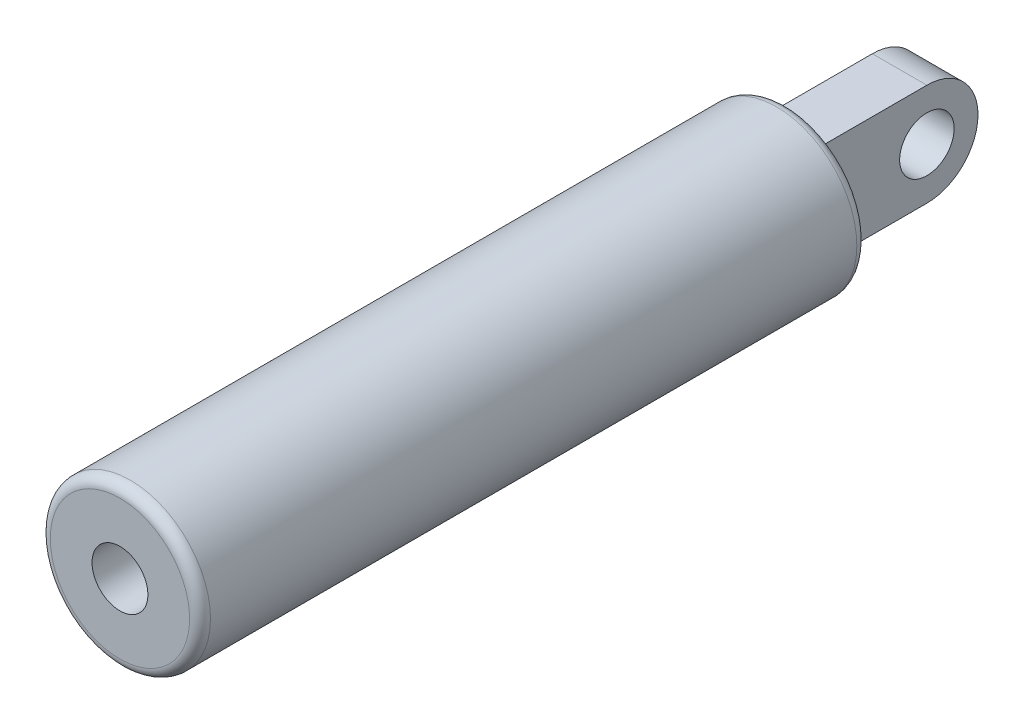
ISO-10303-21;
HEADER;
FILE_DESCRIPTION(('STEP AP214'),'2;1');
FILE_NAME('part.step','',(''),(''),'','','');
FILE_SCHEMA(('AUTOMOTIVE_DESIGN { 1 0 10303 214 1 1 1 1 }'));
ENDSEC;
DATA;
#1=APPLICATION_CONTEXT('core data for automotive mechanical design processes');
#2=APPLICATION_PROTOCOL_DEFINITION('international standard','automotive_design',2000,#1);
#3=PRODUCT_CONTEXT('',#1,'mechanical');
#4=PRODUCT('Part','Part','',(#3));
#5=PRODUCT_RELATED_PRODUCT_CATEGORY('part','',(#4));
#6=PRODUCT_DEFINITION_FORMATION('','',#4);
#7=PRODUCT_DEFINITION_CONTEXT('part definition',#1,'design');
#8=PRODUCT_DEFINITION('design','',#6,#7);
#9=PRODUCT_DEFINITION_SHAPE('','',#8);
#10=(LENGTH_UNIT() NAMED_UNIT(*) SI_UNIT(.MILLI.,.METRE.));
#11=(NAMED_UNIT(*) PLANE_ANGLE_UNIT() SI_UNIT($,.RADIAN.));
#12=(NAMED_UNIT(*) SI_UNIT($,.STERADIAN.) SOLID_ANGLE_UNIT());
#13=UNCERTAINTY_MEASURE_WITH_UNIT(LENGTH_MEASURE(1.E-05),#10,'distance_accuracy_value','');
#14=(GEOMETRIC_REPRESENTATION_CONTEXT(3) GLOBAL_UNCERTAINTY_ASSIGNED_CONTEXT((#13)) GLOBAL_UNIT_ASSIGNED_CONTEXT((#10,
#11,#12)) REPRESENTATION_CONTEXT('',''));
#15=CARTESIAN_POINT('',(0.,0.,0.));
#16=DIRECTION('',(0.,0.,1.));
#17=DIRECTION('',(1.,0.,0.));
#18=AXIS2_PLACEMENT_3D('',#15,#16,#17);
#19=CARTESIAN_POINT('',(0.,0.,-36.703));
#20=DIRECTION('',(0.,0.,1.));
#21=DIRECTION('',(1.,0.,0.));
#22=AXIS2_PLACEMENT_3D('',#19,#20,#21);
#23=PLANE('',#22);
#24=CARTESIAN_POINT('',(0.,0.,-36.703));
#25=DIRECTION('',(0.,0.,1.));
#26=DIRECTION('',(1.,0.,0.));
#27=AXIS2_PLACEMENT_3D('',#24,#25,#26);
#28=CIRCLE('',#27,5.19176);
#29=CARTESIAN_POINT('',(5.19176,0.,-36.703));
#30=VERTEX_POINT('',#29);
#31=EDGE_CURVE('E41',#30,#30,#28,.F.);
#32=ORIENTED_EDGE('',*,*,#31,.T.);
#33=EDGE_LOOP('',(#32));
#34=FACE_BOUND('',#33,.T.);
#35=DIRECTION('',(-1.,0.,0.));
#36=VECTOR('',#35,1.);
#37=CARTESIAN_POINT('',(2.032,-3.81,-36.703));
#38=LINE('',#37,#36);
#39=CARTESIAN_POINT('',(2.032,-3.81,-36.703));
#40=VERTEX_POINT('',#39);
#41=CARTESIAN_POINT('',(-2.032,-3.81,-36.703));
#42=VERTEX_POINT('',#41);
#43=EDGE_CURVE('E48',#40,#42,#38,.T.);
#44=ORIENTED_EDGE('',*,*,#43,.F.);
#45=DIRECTION('',(0.,-1.,0.));
#46=VECTOR('',#45,1.);
#47=CARTESIAN_POINT('',(2.032,-3.81,-36.703));
#48=LINE('',#47,#46);
#49=CARTESIAN_POINT('',(2.032,3.81,-36.703));
#50=VERTEX_POINT('',#49);
#51=EDGE_CURVE('E80',#50,#40,#48,.T.);
#52=ORIENTED_EDGE('',*,*,#51,.F.);
#53=DIRECTION('',(-1.,0.,0.));
#54=VECTOR('',#53,1.);
#55=CARTESIAN_POINT('',(2.032,3.81,-36.703));
#56=LINE('',#55,#54);
#57=CARTESIAN_POINT('',(-2.032,3.81,-36.703));
#58=VERTEX_POINT('',#57);
#59=EDGE_CURVE('E96',#50,#58,#56,.T.);
#60=ORIENTED_EDGE('',*,*,#59,.T.);
#61=DIRECTION('',(0.,-1.,0.));
#62=VECTOR('',#61,1.);
#63=CARTESIAN_POINT('',(-2.032,-3.81,-36.703));
#64=LINE('',#63,#62);
#65=EDGE_CURVE('E53',#58,#42,#64,.T.);
#66=ORIENTED_EDGE('',*,*,#65,.T.);
#67=EDGE_LOOP('',(#44,#52,#60,#66));
#68=FACE_BOUND('',#67,.T.);
#69=ADVANCED_FACE('F33',(#34,#68),#23,.F.);
#70=CARTESIAN_POINT('',(0.,0.,45.085));
#71=DIRECTION('',(0.,0.,1.));
#72=DIRECTION('',(1.,0.,0.));
#73=AXIS2_PLACEMENT_3D('',#70,#71,#72);
#74=CYLINDRICAL_SURFACE('',#73,5.969);
#75=CARTESIAN_POINT('',(0.,0.,-35.92576));
#76=DIRECTION('',(0.,0.,1.));
#77=DIRECTION('',(1.,0.,0.));
#78=AXIS2_PLACEMENT_3D('',#75,#76,#77);
#79=CIRCLE('',#78,5.969);
#80=CARTESIAN_POINT('',(5.969,0.,-35.92576));
#81=VERTEX_POINT('',#80);
#82=EDGE_CURVE('E120',#81,#81,#79,.T.);
#83=ORIENTED_EDGE('',*,*,#82,.T.);
#84=EDGE_LOOP('',(#83));
#85=FACE_BOUND('',#84,.T.);
#86=CARTESIAN_POINT('',(0.,0.,12.25296));
#87=DIRECTION('',(0.,0.,-1.));
#88=DIRECTION('',(-1.,0.,0.));
#89=AXIS2_PLACEMENT_3D('',#86,#87,#88);
#90=CIRCLE('',#89,5.969);
#91=CARTESIAN_POINT('',(-5.969,0.,12.25296));
#92=VERTEX_POINT('',#91);
#93=EDGE_CURVE('E117',#92,#92,#90,.T.);
#94=ORIENTED_EDGE('',*,*,#93,.T.);
#95=EDGE_LOOP('',(#94));
#96=FACE_BOUND('',#95,.T.);
#97=ADVANCED_FACE('F132',(#85,#96),#74,.T.);
#98=CARTESIAN_POINT('',(0.,2.0828,13.0302));
#99=DIRECTION('',(0.,0.,-1.));
#100=DIRECTION('',(-1.,0.,0.));
#101=AXIS2_PLACEMENT_3D('',#98,#99,#100);
#102=PLANE('',#101);
#103=CARTESIAN_POINT('',(0.,0.,13.0302));
#104=DIRECTION('',(0.,0.,-1.));
#105=DIRECTION('',(-1.,0.,0.));
#106=AXIS2_PLACEMENT_3D('',#103,#104,#105);
#107=CIRCLE('',#106,5.19176);
#108=CARTESIAN_POINT('',(-5.19176,0.,13.0302));
#109=VERTEX_POINT('',#108);
#110=EDGE_CURVE('E11',#109,#109,#107,.F.);
#111=ORIENTED_EDGE('',*,*,#110,.T.);
#112=EDGE_LOOP('',(#111));
#113=FACE_BOUND('',#112,.T.);
#114=CARTESIAN_POINT('',(0.,0.,13.0302));
#115=DIRECTION('',(0.,0.,1.));
#116=DIRECTION('',(1.,0.,0.));
#117=AXIS2_PLACEMENT_3D('',#114,#115,#116);
#118=CIRCLE('',#117,2.0828);
#119=CARTESIAN_POINT('',(2.0828,0.,13.0302));
#120=VERTEX_POINT('',#119);
#121=EDGE_CURVE('E114',#120,#120,#118,.T.);
#122=ORIENTED_EDGE('',*,*,#121,.F.);
#123=EDGE_LOOP('',(#122));
#124=FACE_BOUND('',#123,.T.);
#125=ADVANCED_FACE('F135',(#113,#124),#102,.F.);
#126=CARTESIAN_POINT('',(0.,0.,45.085));
#127=DIRECTION('',(0.,0.,1.));
#128=DIRECTION('',(1.,0.,0.));
#129=AXIS2_PLACEMENT_3D('',#126,#127,#128);
#130=CYLINDRICAL_SURFACE('',#129,2.0828);
#131=CARTESIAN_POINT('',(0.,0.,-19.2786));
#132=DIRECTION('',(0.,0.,1.));
#133=DIRECTION('',(1.,0.,0.));
#134=AXIS2_PLACEMENT_3D('',#131,#132,#133);
#135=CIRCLE('',#134,2.0828);
#136=CARTESIAN_POINT('',(2.0828,0.,-19.2786));
#137=VERTEX_POINT('',#136);
#138=EDGE_CURVE('E111',#137,#137,#135,.T.);
#139=ORIENTED_EDGE('',*,*,#138,.F.);
#140=EDGE_LOOP('',(#139));
#141=FACE_BOUND('',#140,.T.);
#142=ORIENTED_EDGE('',*,*,#121,.T.);
#143=EDGE_LOOP('',(#142));
#144=FACE_BOUND('',#143,.T.);
#145=ADVANCED_FACE('F145',(#141,#144),#130,.F.);
#146=CARTESIAN_POINT('',(0.,2.0828,-19.2786));
#147=DIRECTION('',(0.,0.,-1.));
#148=DIRECTION('',(-1.,0.,0.));
#149=AXIS2_PLACEMENT_3D('',#146,#147,#148);
#150=PLANE('',#149);
#151=ORIENTED_EDGE('',*,*,#138,.T.);
#152=EDGE_LOOP('',(#151));
#153=FACE_BOUND('',#152,.T.);
#154=ADVANCED_FACE('F129',(#153),#150,.F.);
#155=CARTESIAN_POINT('',(0.,0.,-35.92576));
#156=DIRECTION('',(0.,0.,1.));
#157=DIRECTION('',(1.,0.,0.));
#158=AXIS2_PLACEMENT_3D('',#155,#156,#157);
#159=TOROIDAL_SURFACE('',#158,5.19176,0.77724);
#160=ORIENTED_EDGE('',*,*,#31,.F.);
#161=EDGE_LOOP('',(#160));
#162=FACE_BOUND('',#161,.T.);
#163=ORIENTED_EDGE('',*,*,#82,.F.);
#164=EDGE_LOOP('',(#163));
#165=FACE_BOUND('',#164,.T.);
#166=ADVANCED_FACE('F126',(#162,#165),#159,.T.);
#167=CARTESIAN_POINT('',(0.,0.,12.25296));
#168=DIRECTION('',(0.,0.,-1.));
#169=DIRECTION('',(-1.,0.,0.));
#170=AXIS2_PLACEMENT_3D('',#167,#168,#169);
#171=TOROIDAL_SURFACE('',#170,5.19176,0.77724);
#172=ORIENTED_EDGE('',*,*,#93,.F.);
#173=EDGE_LOOP('',(#172));
#174=FACE_BOUND('',#173,.T.);
#175=ORIENTED_EDGE('',*,*,#110,.F.);
#176=EDGE_LOOP('',(#175));
#177=FACE_BOUND('',#176,.T.);
#178=ADVANCED_FACE('F35',(#174,#177),#171,.T.);
#179=CARTESIAN_POINT('',(2.032,0.,-45.085));
#180=DIRECTION('',(-1.,0.,0.));
#181=DIRECTION('',(0.,0.,1.));
#182=AXIS2_PLACEMENT_3D('',#179,#180,#181);
#183=PLANE('',#182);
#184=ORIENTED_EDGE('',*,*,#51,.T.);
#185=DIRECTION('',(0.,0.,-1.));
#186=VECTOR('',#185,1.);
#187=CARTESIAN_POINT('',(2.032,-3.81,-36.703));
#188=LINE('',#187,#186);
#189=CARTESIAN_POINT('',(2.032,-3.81,-45.085));
#190=VERTEX_POINT('',#189);
#191=EDGE_CURVE('E72',#40,#190,#188,.T.);
#192=ORIENTED_EDGE('',*,*,#191,.T.);
#193=CARTESIAN_POINT('',(2.032,0.,-45.085));
#194=DIRECTION('',(1.,0.,0.));
#195=DIRECTION('',(0.,0.,1.));
#196=AXIS2_PLACEMENT_3D('',#193,#194,#195);
#197=CIRCLE('',#196,3.81);
#198=CARTESIAN_POINT('',(2.032,3.81,-45.085));
#199=VERTEX_POINT('',#198);
#200=EDGE_CURVE('E78',#190,#199,#197,.T.);
#201=ORIENTED_EDGE('',*,*,#200,.T.);
#202=DIRECTION('',(0.,0.,1.));
#203=VECTOR('',#202,1.);
#204=CARTESIAN_POINT('',(2.032,3.81,-36.703));
#205=LINE('',#204,#203);
#206=EDGE_CURVE('E94',#199,#50,#205,.T.);
#207=ORIENTED_EDGE('',*,*,#206,.T.);
#208=EDGE_LOOP('',(#184,#192,#201,#207));
#209=FACE_BOUND('',#208,.T.);
#210=CARTESIAN_POINT('',(2.032,0.,-45.085));
#211=DIRECTION('',(1.,0.,0.));
#212=DIRECTION('',(0.,0.,-1.));
#213=AXIS2_PLACEMENT_3D('',#210,#211,#212);
#214=CIRCLE('',#213,2.03199999999998);
#215=CARTESIAN_POINT('',(2.032,0.,-47.117));
#216=VERTEX_POINT('',#215);
#217=EDGE_CURVE('E101',#216,#216,#214,.T.);
#218=ORIENTED_EDGE('',*,*,#217,.F.);
#219=EDGE_LOOP('',(#218));
#220=FACE_BOUND('',#219,.T.);
#221=ADVANCED_FACE('F74',(#209,#220),#183,.F.);
#222=CARTESIAN_POINT('',(-2.032,0.,-45.085));
#223=DIRECTION('',(-1.,0.,0.));
#224=DIRECTION('',(0.,0.,1.));
#225=AXIS2_PLACEMENT_3D('',#222,#223,#224);
#226=PLANE('',#225);
#227=ORIENTED_EDGE('',*,*,#65,.F.);
#228=DIRECTION('',(0.,0.,1.));
#229=VECTOR('',#228,1.);
#230=CARTESIAN_POINT('',(-2.032,3.81,-36.703));
#231=LINE('',#230,#229);
#232=CARTESIAN_POINT('',(-2.032,3.81,-45.085));
#233=VERTEX_POINT('',#232);
#234=EDGE_CURVE('E105',#233,#58,#231,.T.);
#235=ORIENTED_EDGE('',*,*,#234,.F.);
#236=CARTESIAN_POINT('',(-2.032,0.,-45.085));
#237=DIRECTION('',(1.,0.,0.));
#238=DIRECTION('',(0.,0.,1.));
#239=AXIS2_PLACEMENT_3D('',#236,#237,#238);
#240=CIRCLE('',#239,3.81);
#241=CARTESIAN_POINT('',(-2.032,-3.81,-45.085));
#242=VERTEX_POINT('',#241);
#243=EDGE_CURVE('E103',#242,#233,#240,.T.);
#244=ORIENTED_EDGE('',*,*,#243,.F.);
#245=DIRECTION('',(0.,0.,-1.));
#246=VECTOR('',#245,1.);
#247=CARTESIAN_POINT('',(-2.032,-3.81,-36.703));
#248=LINE('',#247,#246);
#249=EDGE_CURVE('E86',#42,#242,#248,.T.);
#250=ORIENTED_EDGE('',*,*,#249,.F.);
#251=EDGE_LOOP('',(#227,#235,#244,#250));
#252=FACE_BOUND('',#251,.T.);
#253=CARTESIAN_POINT('',(-2.032,0.,-45.085));
#254=DIRECTION('',(1.,0.,0.));
#255=DIRECTION('',(0.,0.,-1.));
#256=AXIS2_PLACEMENT_3D('',#253,#254,#255);
#257=CIRCLE('',#256,2.03199999999998);
#258=CARTESIAN_POINT('',(-2.032,0.,-47.117));
#259=VERTEX_POINT('',#258);
#260=EDGE_CURVE('E260',#259,#259,#257,.T.);
#261=ORIENTED_EDGE('',*,*,#260,.T.);
#262=EDGE_LOOP('',(#261));
#263=FACE_BOUND('',#262,.T.);
#264=ADVANCED_FACE('F207',(#252,#263),#226,.T.);
#265=CARTESIAN_POINT('',(2.032,-3.81,-36.703));
#266=DIRECTION('',(0.,1.,0.));
#267=DIRECTION('',(0.,0.,1.));
#268=AXIS2_PLACEMENT_3D('',#265,#266,#267);
#269=PLANE('',#268);
#270=ORIENTED_EDGE('',*,*,#249,.T.);
#271=DIRECTION('',(-1.,0.,0.));
#272=VECTOR('',#271,1.);
#273=CARTESIAN_POINT('',(2.032,-3.81,-45.085));
#274=LINE('',#273,#272);
#275=EDGE_CURVE('E84',#190,#242,#274,.T.);
#276=ORIENTED_EDGE('',*,*,#275,.F.);
#277=ORIENTED_EDGE('',*,*,#191,.F.);
#278=ORIENTED_EDGE('',*,*,#43,.T.);
#279=EDGE_LOOP('',(#270,#276,#277,#278));
#280=FACE_BOUND('',#279,.T.);
#281=ADVANCED_FACE('F85',(#280),#269,.F.);
#282=CARTESIAN_POINT('',(2.032,0.,-45.085));
#283=DIRECTION('',(-1.,0.,0.));
#284=DIRECTION('',(0.,0.,1.));
#285=AXIS2_PLACEMENT_3D('',#282,#283,#284);
#286=CYLINDRICAL_SURFACE('',#285,3.81);
#287=ORIENTED_EDGE('',*,*,#243,.T.);
#288=DIRECTION('',(-1.,0.,0.));
#289=VECTOR('',#288,1.);
#290=CARTESIAN_POINT('',(2.032,3.81,-45.085));
#291=LINE('',#290,#289);
#292=EDGE_CURVE('E89',#199,#233,#291,.T.);
#293=ORIENTED_EDGE('',*,*,#292,.F.);
#294=ORIENTED_EDGE('',*,*,#200,.F.);
#295=ORIENTED_EDGE('',*,*,#275,.T.);
#296=EDGE_LOOP('',(#287,#293,#294,#295));
#297=FACE_BOUND('',#296,.T.);
#298=ADVANCED_FACE('F91',(#297),#286,.T.);
#299=CARTESIAN_POINT('',(2.032,3.81,-36.703));
#300=DIRECTION('',(0.,-1.,0.));
#301=DIRECTION('',(0.,0.,-1.));
#302=AXIS2_PLACEMENT_3D('',#299,#300,#301);
#303=PLANE('',#302);
#304=ORIENTED_EDGE('',*,*,#234,.T.);
#305=ORIENTED_EDGE('',*,*,#59,.F.);
#306=ORIENTED_EDGE('',*,*,#206,.F.);
#307=ORIENTED_EDGE('',*,*,#292,.T.);
#308=EDGE_LOOP('',(#304,#305,#306,#307));
#309=FACE_BOUND('',#308,.T.);
#310=ADVANCED_FACE('F233',(#309),#303,.F.);
#311=CARTESIAN_POINT('',(2.032,0.,-45.085));
#312=DIRECTION('',(-1.,0.,0.));
#313=DIRECTION('',(0.,0.,1.));
#314=AXIS2_PLACEMENT_3D('',#311,#312,#313);
#315=CYLINDRICAL_SURFACE('',#314,2.03199999999998);
#316=ORIENTED_EDGE('',*,*,#217,.T.);
#317=EDGE_LOOP('',(#316));
#318=FACE_BOUND('',#317,.T.);
#319=ORIENTED_EDGE('',*,*,#260,.F.);
#320=EDGE_LOOP('',(#319));
#321=FACE_BOUND('',#320,.T.);
#322=ADVANCED_FACE('F242',(#318,#321),#315,.F.);
#323=CLOSED_SHELL('',(#69,#97,#125,#145,#154,#166,#178,#221,#264,#281,#298,#310,#322));
#324=MANIFOLD_SOLID_BREP('B2',#323);
#325=ADVANCED_BREP_SHAPE_REPRESENTATION('',(#18,#324),#14);
#326=SHAPE_DEFINITION_REPRESENTATION(#9,#325);
ENDSEC;
END-ISO-10303-21;
